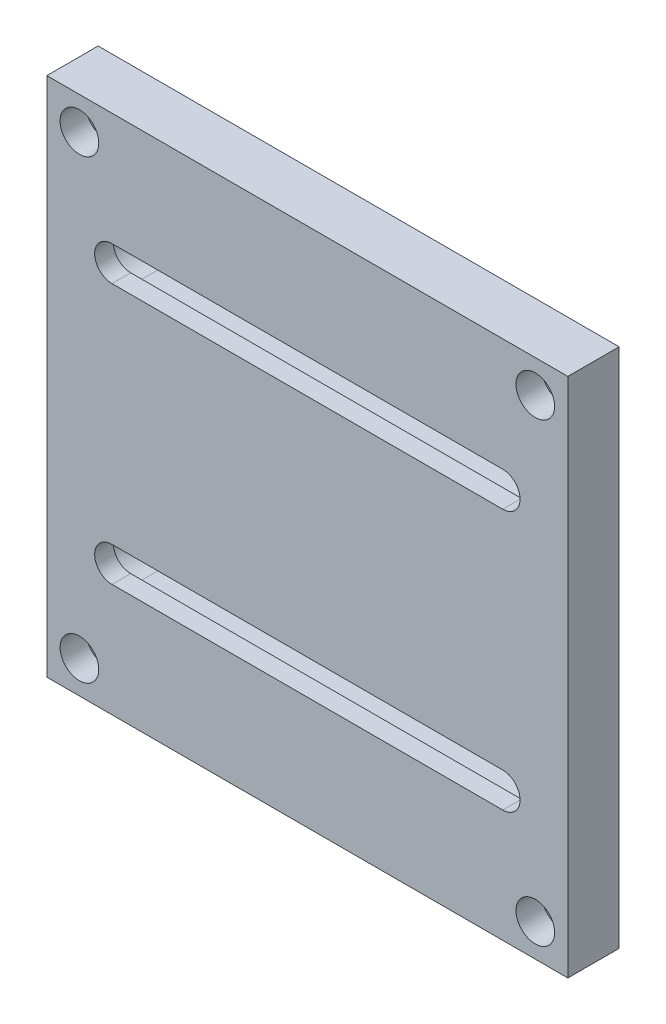
ISO-10303-21;
HEADER;
FILE_DESCRIPTION(('STEP AP214'),'2;1');
FILE_NAME('part.step','',(''),(''),'','','');
FILE_SCHEMA(('AUTOMOTIVE_DESIGN { 1 0 10303 214 1 1 1 1 }'));
ENDSEC;
DATA;
#1=APPLICATION_CONTEXT('core data for automotive mechanical design processes');
#2=APPLICATION_PROTOCOL_DEFINITION('international standard','automotive_design',2000,#1);
#3=PRODUCT_CONTEXT('',#1,'mechanical');
#4=PRODUCT('Part','Part','',(#3));
#5=PRODUCT_RELATED_PRODUCT_CATEGORY('part','',(#4));
#6=PRODUCT_DEFINITION_FORMATION('','',#4);
#7=PRODUCT_DEFINITION_CONTEXT('part definition',#1,'design');
#8=PRODUCT_DEFINITION('design','',#6,#7);
#9=PRODUCT_DEFINITION_SHAPE('','',#8);
#10=(LENGTH_UNIT() NAMED_UNIT(*) SI_UNIT(.MILLI.,.METRE.));
#11=(NAMED_UNIT(*) PLANE_ANGLE_UNIT() SI_UNIT($,.RADIAN.));
#12=(NAMED_UNIT(*) SI_UNIT($,.STERADIAN.) SOLID_ANGLE_UNIT());
#13=UNCERTAINTY_MEASURE_WITH_UNIT(LENGTH_MEASURE(1.E-05),#10,'distance_accuracy_value','');
#14=(GEOMETRIC_REPRESENTATION_CONTEXT(3) GLOBAL_UNCERTAINTY_ASSIGNED_CONTEXT((#13)) GLOBAL_UNIT_ASSIGNED_CONTEXT((#10,
#11,#12)) REPRESENTATION_CONTEXT('',''));
#15=CARTESIAN_POINT('',(0.,0.,0.));
#16=DIRECTION('',(0.,0.,1.));
#17=DIRECTION('',(1.,0.,0.));
#18=AXIS2_PLACEMENT_3D('',#15,#16,#17);
#19=CARTESIAN_POINT('',(-6.35000000000003,-69.85,0.));
#20=DIRECTION('',(0.,0.,-1.));
#21=DIRECTION('',(-1.,0.,0.));
#22=AXIS2_PLACEMENT_3D('',#19,#20,#21);
#23=CYLINDRICAL_SURFACE('',#22,3.3782);
#24=DIRECTION('',(0.,0.,-1.));
#25=VECTOR('',#24,1.);
#26=CARTESIAN_POINT('',(-6.35000000000003,-66.4718,10.));
#27=LINE('',#26,#25);
#28=CARTESIAN_POINT('',(-6.35000000000003,-66.4718,10.));
#29=VERTEX_POINT('',#28);
#30=CARTESIAN_POINT('',(-6.35000000000003,-66.4718,6.35));
#31=VERTEX_POINT('',#30);
#32=EDGE_CURVE('E650',#29,#31,#27,.T.);
#33=ORIENTED_EDGE('',*,*,#32,.T.);
#34=CARTESIAN_POINT('',(-6.35000000000003,-69.85,6.35));
#35=DIRECTION('',(0.,0.,-1.));
#36=DIRECTION('',(-1.,0.,0.));
#37=AXIS2_PLACEMENT_3D('',#34,#35,#36);
#38=CIRCLE('',#37,3.37820000000001);
#39=CARTESIAN_POINT('',(-6.35000000000003,-73.2282,6.35));
#40=VERTEX_POINT('',#39);
#41=EDGE_CURVE('E661',#31,#40,#38,.T.);
#42=ORIENTED_EDGE('',*,*,#41,.T.);
#43=DIRECTION('',(0.,0.,-1.));
#44=VECTOR('',#43,1.);
#45=CARTESIAN_POINT('',(-6.35000000000003,-73.2282,10.));
#46=LINE('',#45,#44);
#47=CARTESIAN_POINT('',(-6.35000000000003,-73.2282,10.));
#48=VERTEX_POINT('',#47);
#49=EDGE_CURVE('E789',#48,#40,#46,.T.);
#50=ORIENTED_EDGE('',*,*,#49,.F.);
#51=CARTESIAN_POINT('',(-6.35000000000003,-69.85,10.));
#52=DIRECTION('',(0.,0.,-1.));
#53=DIRECTION('',(-1.,0.,0.));
#54=AXIS2_PLACEMENT_3D('',#51,#52,#53);
#55=CIRCLE('',#54,3.3782);
#56=EDGE_CURVE('E663',#29,#48,#55,.T.);
#57=ORIENTED_EDGE('',*,*,#56,.F.);
#58=EDGE_LOOP('',(#33,#42,#50,#57));
#59=FACE_BOUND('',#58,.T.);
#60=ADVANCED_FACE('F33',(#59),#23,.F.);
#61=CARTESIAN_POINT('',(-82.55,-19.05,0.));
#62=DIRECTION('',(0.,0.,-1.));
#63=DIRECTION('',(-1.,0.,0.));
#64=AXIS2_PLACEMENT_3D('',#61,#62,#63);
#65=CYLINDRICAL_SURFACE('',#64,3.3782);
#66=DIRECTION('',(0.,0.,-1.));
#67=VECTOR('',#66,1.);
#68=CARTESIAN_POINT('',(-82.55,-22.4282,10.));
#69=LINE('',#68,#67);
#70=CARTESIAN_POINT('',(-82.55,-22.4282,10.));
#71=VERTEX_POINT('',#70);
#72=CARTESIAN_POINT('',(-82.55,-22.4282,6.35));
#73=VERTEX_POINT('',#72);
#74=EDGE_CURVE('E704',#71,#73,#69,.T.);
#75=ORIENTED_EDGE('',*,*,#74,.T.);
#76=CARTESIAN_POINT('',(-82.55,-19.05,6.35));
#77=DIRECTION('',(0.,0.,-1.));
#78=DIRECTION('',(-1.,0.,0.));
#79=AXIS2_PLACEMENT_3D('',#76,#77,#78);
#80=CIRCLE('',#79,3.37820000000001);
#81=CARTESIAN_POINT('',(-82.55,-15.6718,6.35));
#82=VERTEX_POINT('',#81);
#83=EDGE_CURVE('E725',#73,#82,#80,.T.);
#84=ORIENTED_EDGE('',*,*,#83,.T.);
#85=DIRECTION('',(0.,0.,-1.));
#86=VECTOR('',#85,1.);
#87=CARTESIAN_POINT('',(-82.55,-15.6718,10.));
#88=LINE('',#87,#86);
#89=CARTESIAN_POINT('',(-82.55,-15.6718,10.));
#90=VERTEX_POINT('',#89);
#91=EDGE_CURVE('E181',#90,#82,#88,.T.);
#92=ORIENTED_EDGE('',*,*,#91,.F.);
#93=CARTESIAN_POINT('',(-82.55,-19.05,10.));
#94=DIRECTION('',(0.,0.,-1.));
#95=DIRECTION('',(-1.,0.,0.));
#96=AXIS2_PLACEMENT_3D('',#93,#94,#95);
#97=CIRCLE('',#96,3.3782);
#98=EDGE_CURVE('E191',#71,#90,#97,.T.);
#99=ORIENTED_EDGE('',*,*,#98,.F.);
#100=EDGE_LOOP('',(#75,#84,#92,#99));
#101=FACE_BOUND('',#100,.T.);
#102=ADVANCED_FACE('F301',(#101),#65,.F.);
#103=CARTESIAN_POINT('',(6.34999999999999,6.34999999999998,10.));
#104=DIRECTION('',(-1.,0.,0.));
#105=DIRECTION('',(0.,0.,1.));
#106=AXIS2_PLACEMENT_3D('',#103,#104,#105);
#107=PLANE('',#106);
#108=DIRECTION('',(0.,1.,0.));
#109=VECTOR('',#108,1.);
#110=CARTESIAN_POINT('',(6.34999999999999,6.34999999999998,0.));
#111=LINE('',#110,#109);
#112=CARTESIAN_POINT('',(6.34999999999999,-95.25,0.));
#113=VERTEX_POINT('',#112);
#114=CARTESIAN_POINT('',(6.34999999999999,6.34999999999998,0.));
#115=VERTEX_POINT('',#114);
#116=EDGE_CURVE('E251',#113,#115,#111,.T.);
#117=ORIENTED_EDGE('',*,*,#116,.T.);
#118=DIRECTION('',(0.,0.,-1.));
#119=VECTOR('',#118,1.);
#120=CARTESIAN_POINT('',(6.34999999999999,6.34999999999998,10.));
#121=LINE('',#120,#119);
#122=CARTESIAN_POINT('',(6.34999999999999,6.34999999999998,10.));
#123=VERTEX_POINT('',#122);
#124=EDGE_CURVE('E11',#123,#115,#121,.T.);
#125=ORIENTED_EDGE('',*,*,#124,.F.);
#126=DIRECTION('',(0.,1.,0.));
#127=VECTOR('',#126,1.);
#128=CARTESIAN_POINT('',(6.34999999999999,6.34999999999998,10.));
#129=LINE('',#128,#127);
#130=CARTESIAN_POINT('',(6.34999999999999,-95.25,10.));
#131=VERTEX_POINT('',#130);
#132=EDGE_CURVE('E252',#131,#123,#129,.T.);
#133=ORIENTED_EDGE('',*,*,#132,.F.);
#134=DIRECTION('',(0.,0.,-1.));
#135=VECTOR('',#134,1.);
#136=CARTESIAN_POINT('',(6.34999999999999,-95.25,10.));
#137=LINE('',#136,#135);
#138=EDGE_CURVE('E262',#131,#113,#137,.T.);
#139=ORIENTED_EDGE('',*,*,#138,.T.);
#140=EDGE_LOOP('',(#117,#125,#133,#139));
#141=FACE_BOUND('',#140,.T.);
#142=ADVANCED_FACE('F35',(#141),#107,.F.);
#143=CARTESIAN_POINT('',(6.34999999999999,6.34999999999998,10.));
#144=DIRECTION('',(0.,-1.,0.));
#145=DIRECTION('',(0.,0.,-1.));
#146=AXIS2_PLACEMENT_3D('',#143,#144,#145);
#147=PLANE('',#146);
#148=DIRECTION('',(-1.,0.,0.));
#149=VECTOR('',#148,1.);
#150=CARTESIAN_POINT('',(6.34999999999999,6.34999999999998,0.));
#151=LINE('',#150,#149);
#152=CARTESIAN_POINT('',(-95.25,6.34999999999998,0.));
#153=VERTEX_POINT('',#152);
#154=EDGE_CURVE('E265',#115,#153,#151,.T.);
#155=ORIENTED_EDGE('',*,*,#154,.T.);
#156=DIRECTION('',(0.,0.,-1.));
#157=VECTOR('',#156,1.);
#158=CARTESIAN_POINT('',(-95.25,6.34999999999998,10.));
#159=LINE('',#158,#157);
#160=CARTESIAN_POINT('',(-95.25,6.34999999999998,10.));
#161=VERTEX_POINT('',#160);
#162=EDGE_CURVE('E41',#161,#153,#159,.T.);
#163=ORIENTED_EDGE('',*,*,#162,.F.);
#164=DIRECTION('',(-1.,0.,0.));
#165=VECTOR('',#164,1.);
#166=CARTESIAN_POINT('',(6.34999999999999,6.34999999999998,10.));
#167=LINE('',#166,#165);
#168=EDGE_CURVE('E255',#123,#161,#167,.T.);
#169=ORIENTED_EDGE('',*,*,#168,.F.);
#170=ORIENTED_EDGE('',*,*,#124,.T.);
#171=EDGE_LOOP('',(#155,#163,#169,#170));
#172=FACE_BOUND('',#171,.T.);
#173=ADVANCED_FACE('F294',(#172),#147,.F.);
#174=CARTESIAN_POINT('',(-95.25,6.34999999999998,10.));
#175=DIRECTION('',(1.,0.,0.));
#176=DIRECTION('',(0.,0.,-1.));
#177=AXIS2_PLACEMENT_3D('',#174,#175,#176);
#178=PLANE('',#177);
#179=DIRECTION('',(0.,-1.,0.));
#180=VECTOR('',#179,1.);
#181=CARTESIAN_POINT('',(-95.25,6.34999999999998,0.));
#182=LINE('',#181,#180);
#183=CARTESIAN_POINT('',(-95.25,-95.25,0.));
#184=VERTEX_POINT('',#183);
#185=EDGE_CURVE('E267',#153,#184,#182,.T.);
#186=ORIENTED_EDGE('',*,*,#185,.T.);
#187=DIRECTION('',(0.,0.,-1.));
#188=VECTOR('',#187,1.);
#189=CARTESIAN_POINT('',(-95.25,-95.25,10.));
#190=LINE('',#189,#188);
#191=CARTESIAN_POINT('',(-95.25,-95.25,10.));
#192=VERTEX_POINT('',#191);
#193=EDGE_CURVE('E272',#192,#184,#190,.T.);
#194=ORIENTED_EDGE('',*,*,#193,.F.);
#195=DIRECTION('',(0.,-1.,0.));
#196=VECTOR('',#195,1.);
#197=CARTESIAN_POINT('',(-95.25,6.34999999999998,10.));
#198=LINE('',#197,#196);
#199=EDGE_CURVE('E258',#161,#192,#198,.T.);
#200=ORIENTED_EDGE('',*,*,#199,.F.);
#201=ORIENTED_EDGE('',*,*,#162,.T.);
#202=EDGE_LOOP('',(#186,#194,#200,#201));
#203=FACE_BOUND('',#202,.T.);
#204=ADVANCED_FACE('F279',(#203),#178,.F.);
#205=CARTESIAN_POINT('',(6.34999999999999,-95.25,10.));
#206=DIRECTION('',(0.,1.,0.));
#207=DIRECTION('',(0.,0.,1.));
#208=AXIS2_PLACEMENT_3D('',#205,#206,#207);
#209=PLANE('',#208);
#210=DIRECTION('',(1.,0.,0.));
#211=VECTOR('',#210,1.);
#212=CARTESIAN_POINT('',(6.34999999999999,-95.25,0.));
#213=LINE('',#212,#211);
#214=EDGE_CURVE('E256',#184,#113,#213,.T.);
#215=ORIENTED_EDGE('',*,*,#214,.T.);
#216=ORIENTED_EDGE('',*,*,#138,.F.);
#217=DIRECTION('',(1.,0.,0.));
#218=VECTOR('',#217,1.);
#219=CARTESIAN_POINT('',(6.34999999999999,-95.25,10.));
#220=LINE('',#219,#218);
#221=EDGE_CURVE('E260',#192,#131,#220,.T.);
#222=ORIENTED_EDGE('',*,*,#221,.F.);
#223=ORIENTED_EDGE('',*,*,#193,.T.);
#224=EDGE_LOOP('',(#215,#216,#222,#223));
#225=FACE_BOUND('',#224,.T.);
#226=ADVANCED_FACE('F288',(#225),#209,.F.);
#227=CARTESIAN_POINT('',(0.,0.,10.));
#228=DIRECTION('',(0.,0.,-1.));
#229=DIRECTION('',(-1.,0.,0.));
#230=AXIS2_PLACEMENT_3D('',#227,#228,#229);
#231=PLANE('',#230);
#232=CARTESIAN_POINT('',(-6.35000000000003,-19.05,10.));
#233=DIRECTION('',(0.,0.,-1.));
#234=DIRECTION('',(-1.,0.,0.));
#235=AXIS2_PLACEMENT_3D('',#232,#233,#234);
#236=CIRCLE('',#235,3.3782);
#237=CARTESIAN_POINT('',(-6.35000000000003,-15.6718,10.));
#238=VERTEX_POINT('',#237);
#239=CARTESIAN_POINT('',(-6.35000000000003,-22.4282,10.));
#240=VERTEX_POINT('',#239);
#241=EDGE_CURVE('E189',#238,#240,#236,.T.);
#242=ORIENTED_EDGE('',*,*,#241,.T.);
#243=DIRECTION('',(-1.,0.,0.));
#244=VECTOR('',#243,1.);
#245=CARTESIAN_POINT('',(-82.55,-22.4282,10.));
#246=LINE('',#245,#244);
#247=EDGE_CURVE('E192',#240,#71,#246,.T.);
#248=ORIENTED_EDGE('',*,*,#247,.T.);
#249=ORIENTED_EDGE('',*,*,#98,.T.);
#250=DIRECTION('',(1.,0.,0.));
#251=VECTOR('',#250,1.);
#252=CARTESIAN_POINT('',(-82.55,-15.6718,10.));
#253=LINE('',#252,#251);
#254=EDGE_CURVE('E172',#90,#238,#253,.T.);
#255=ORIENTED_EDGE('',*,*,#254,.T.);
#256=EDGE_LOOP('',(#242,#248,#249,#255));
#257=FACE_BOUND('',#256,.T.);
#258=CARTESIAN_POINT('',(-82.55,-69.85,10.));
#259=DIRECTION('',(0.,0.,-1.));
#260=DIRECTION('',(-1.,0.,0.));
#261=AXIS2_PLACEMENT_3D('',#258,#259,#260);
#262=CIRCLE('',#261,3.3782);
#263=CARTESIAN_POINT('',(-82.55,-73.2282,10.));
#264=VERTEX_POINT('',#263);
#265=CARTESIAN_POINT('',(-82.55,-66.4718,10.));
#266=VERTEX_POINT('',#265);
#267=EDGE_CURVE('E737',#264,#266,#262,.T.);
#268=ORIENTED_EDGE('',*,*,#267,.T.);
#269=DIRECTION('',(1.,0.,0.));
#270=VECTOR('',#269,1.);
#271=CARTESIAN_POINT('',(-6.35000000000003,-66.4718,10.));
#272=LINE('',#271,#270);
#273=EDGE_CURVE('E56',#266,#29,#272,.T.);
#274=ORIENTED_EDGE('',*,*,#273,.T.);
#275=ORIENTED_EDGE('',*,*,#56,.T.);
#276=DIRECTION('',(-1.,0.,0.));
#277=VECTOR('',#276,1.);
#278=CARTESIAN_POINT('',(-6.35000000000003,-73.2282,10.));
#279=LINE('',#278,#277);
#280=EDGE_CURVE('E656',#48,#264,#279,.T.);
#281=ORIENTED_EDGE('',*,*,#280,.T.);
#282=EDGE_LOOP('',(#268,#274,#275,#281));
#283=FACE_BOUND('',#282,.T.);
#284=CARTESIAN_POINT('',(0.,0.,10.));
#285=DIRECTION('',(0.,0.,1.));
#286=DIRECTION('',(1.,0.,0.));
#287=AXIS2_PLACEMENT_3D('',#284,#285,#286);
#288=CIRCLE('',#287,3.77063);
#289=CARTESIAN_POINT('',(3.77063,0.,10.));
#290=VERTEX_POINT('',#289);
#291=EDGE_CURVE('E197',#290,#290,#288,.T.);
#292=ORIENTED_EDGE('',*,*,#291,.F.);
#293=EDGE_LOOP('',(#292));
#294=FACE_BOUND('',#293,.T.);
#295=CARTESIAN_POINT('',(0.,-88.9,10.));
#296=DIRECTION('',(0.,0.,1.));
#297=DIRECTION('',(1.,0.,0.));
#298=AXIS2_PLACEMENT_3D('',#295,#296,#297);
#299=CIRCLE('',#298,3.77063);
#300=CARTESIAN_POINT('',(3.77063,-88.9,10.));
#301=VERTEX_POINT('',#300);
#302=EDGE_CURVE('E215',#301,#301,#299,.T.);
#303=ORIENTED_EDGE('',*,*,#302,.F.);
#304=EDGE_LOOP('',(#303));
#305=FACE_BOUND('',#304,.T.);
#306=CARTESIAN_POINT('',(-88.9,-88.9,10.));
#307=DIRECTION('',(0.,0.,1.));
#308=DIRECTION('',(1.,0.,0.));
#309=AXIS2_PLACEMENT_3D('',#306,#307,#308);
#310=CIRCLE('',#309,3.77063);
#311=CARTESIAN_POINT('',(-85.12937,-88.9,10.));
#312=VERTEX_POINT('',#311);
#313=EDGE_CURVE('E227',#312,#312,#310,.T.);
#314=ORIENTED_EDGE('',*,*,#313,.F.);
#315=EDGE_LOOP('',(#314));
#316=FACE_BOUND('',#315,.T.);
#317=CARTESIAN_POINT('',(-88.9,0.,10.));
#318=DIRECTION('',(0.,0.,1.));
#319=DIRECTION('',(1.,0.,0.));
#320=AXIS2_PLACEMENT_3D('',#317,#318,#319);
#321=CIRCLE('',#320,3.77063);
#322=CARTESIAN_POINT('',(-85.12937,0.,10.));
#323=VERTEX_POINT('',#322);
#324=EDGE_CURVE('E239',#323,#323,#321,.T.);
#325=ORIENTED_EDGE('',*,*,#324,.F.);
#326=EDGE_LOOP('',(#325));
#327=FACE_BOUND('',#326,.T.);
#328=ORIENTED_EDGE('',*,*,#132,.T.);
#329=ORIENTED_EDGE('',*,*,#168,.T.);
#330=ORIENTED_EDGE('',*,*,#199,.T.);
#331=ORIENTED_EDGE('',*,*,#221,.T.);
#332=EDGE_LOOP('',(#328,#329,#330,#331));
#333=FACE_BOUND('',#332,.T.);
#334=ADVANCED_FACE('F186',(#257,#283,#294,#305,#316,#327,#333),#231,.F.);
#335=CARTESIAN_POINT('',(0.,0.,0.));
#336=DIRECTION('',(0.,0.,-1.));
#337=DIRECTION('',(-1.,0.,0.));
#338=AXIS2_PLACEMENT_3D('',#335,#336,#337);
#339=PLANE('',#338);
#340=DIRECTION('',(1.,0.,0.));
#341=VECTOR('',#340,1.);
#342=CARTESIAN_POINT('',(-82.55,-13.49375,0.));
#343=LINE('',#342,#341);
#344=CARTESIAN_POINT('',(-82.55,-13.49375,0.));
#345=VERTEX_POINT('',#344);
#346=CARTESIAN_POINT('',(-6.35000000000003,-13.49375,0.));
#347=VERTEX_POINT('',#346);
#348=EDGE_CURVE('E720',#345,#347,#343,.T.);
#349=ORIENTED_EDGE('',*,*,#348,.F.);
#350=CARTESIAN_POINT('',(-82.55,-19.05,0.));
#351=DIRECTION('',(0.,0.,-1.));
#352=DIRECTION('',(-1.,0.,0.));
#353=AXIS2_PLACEMENT_3D('',#350,#351,#352);
#354=CIRCLE('',#353,5.55625);
#355=CARTESIAN_POINT('',(-82.55,-24.60625,0.));
#356=VERTEX_POINT('',#355);
#357=EDGE_CURVE('E698',#356,#345,#354,.T.);
#358=ORIENTED_EDGE('',*,*,#357,.F.);
#359=DIRECTION('',(-1.,0.,0.));
#360=VECTOR('',#359,1.);
#361=CARTESIAN_POINT('',(-82.55,-24.60625,0.));
#362=LINE('',#361,#360);
#363=CARTESIAN_POINT('',(-6.35000000000003,-24.60625,0.));
#364=VERTEX_POINT('',#363);
#365=EDGE_CURVE('E793',#364,#356,#362,.T.);
#366=ORIENTED_EDGE('',*,*,#365,.F.);
#367=CARTESIAN_POINT('',(-6.35000000000003,-19.05,0.));
#368=DIRECTION('',(0.,0.,-1.));
#369=DIRECTION('',(-1.,0.,0.));
#370=AXIS2_PLACEMENT_3D('',#367,#368,#369);
#371=CIRCLE('',#370,5.55625);
#372=EDGE_CURVE('E667',#347,#364,#371,.T.);
#373=ORIENTED_EDGE('',*,*,#372,.F.);
#374=EDGE_LOOP('',(#349,#358,#366,#373));
#375=FACE_BOUND('',#374,.T.);
#376=DIRECTION('',(-1.,0.,0.));
#377=VECTOR('',#376,1.);
#378=CARTESIAN_POINT('',(-6.35000000000003,-75.40625,0.));
#379=LINE('',#378,#377);
#380=CARTESIAN_POINT('',(-6.35000000000003,-75.40625,0.));
#381=VERTEX_POINT('',#380);
#382=CARTESIAN_POINT('',(-82.55,-75.40625,0.));
#383=VERTEX_POINT('',#382);
#384=EDGE_CURVE('E702',#381,#383,#379,.T.);
#385=ORIENTED_EDGE('',*,*,#384,.F.);
#386=CARTESIAN_POINT('',(-6.35000000000003,-69.85,0.));
#387=DIRECTION('',(0.,0.,-1.));
#388=DIRECTION('',(-1.,0.,0.));
#389=AXIS2_PLACEMENT_3D('',#386,#387,#388);
#390=CIRCLE('',#389,5.55625);
#391=CARTESIAN_POINT('',(-6.35000000000003,-64.29375,0.));
#392=VERTEX_POINT('',#391);
#393=EDGE_CURVE('E670',#392,#381,#390,.T.);
#394=ORIENTED_EDGE('',*,*,#393,.F.);
#395=DIRECTION('',(1.,0.,0.));
#396=VECTOR('',#395,1.);
#397=CARTESIAN_POINT('',(-6.35000000000003,-64.29375,0.));
#398=LINE('',#397,#396);
#399=CARTESIAN_POINT('',(-82.55,-64.29375,0.));
#400=VERTEX_POINT('',#399);
#401=EDGE_CURVE('E699',#400,#392,#398,.T.);
#402=ORIENTED_EDGE('',*,*,#401,.F.);
#403=CARTESIAN_POINT('',(-82.55,-69.85,0.));
#404=DIRECTION('',(0.,0.,-1.));
#405=DIRECTION('',(-1.,0.,0.));
#406=AXIS2_PLACEMENT_3D('',#403,#404,#405);
#407=CIRCLE('',#406,5.55625);
#408=EDGE_CURVE('E729',#383,#400,#407,.T.);
#409=ORIENTED_EDGE('',*,*,#408,.F.);
#410=EDGE_LOOP('',(#385,#394,#402,#409));
#411=FACE_BOUND('',#410,.T.);
#412=CARTESIAN_POINT('',(0.,0.,0.));
#413=DIRECTION('',(0.,0.,1.));
#414=DIRECTION('',(1.,0.,0.));
#415=AXIS2_PLACEMENT_3D('',#412,#413,#414);
#416=CIRCLE('',#415,1.89865);
#417=CARTESIAN_POINT('',(1.89865,0.,0.));
#418=VERTEX_POINT('',#417);
#419=EDGE_CURVE('E212',#418,#418,#416,.T.);
#420=ORIENTED_EDGE('',*,*,#419,.T.);
#421=EDGE_LOOP('',(#420));
#422=FACE_BOUND('',#421,.T.);
#423=CARTESIAN_POINT('',(0.,-88.9,0.));
#424=DIRECTION('',(0.,0.,1.));
#425=DIRECTION('',(1.,0.,0.));
#426=AXIS2_PLACEMENT_3D('',#423,#424,#425);
#427=CIRCLE('',#426,1.89865);
#428=CARTESIAN_POINT('',(1.89865,-88.9,0.));
#429=VERTEX_POINT('',#428);
#430=EDGE_CURVE('E224',#429,#429,#427,.T.);
#431=ORIENTED_EDGE('',*,*,#430,.T.);
#432=EDGE_LOOP('',(#431));
#433=FACE_BOUND('',#432,.T.);
#434=CARTESIAN_POINT('',(-88.9,-88.9,0.));
#435=DIRECTION('',(0.,0.,1.));
#436=DIRECTION('',(1.,0.,0.));
#437=AXIS2_PLACEMENT_3D('',#434,#435,#436);
#438=CIRCLE('',#437,1.89865);
#439=CARTESIAN_POINT('',(-87.00135,-88.9,0.));
#440=VERTEX_POINT('',#439);
#441=EDGE_CURVE('E236',#440,#440,#438,.T.);
#442=ORIENTED_EDGE('',*,*,#441,.T.);
#443=EDGE_LOOP('',(#442));
#444=FACE_BOUND('',#443,.T.);
#445=CARTESIAN_POINT('',(-88.9,0.,0.));
#446=DIRECTION('',(0.,0.,1.));
#447=DIRECTION('',(1.,0.,0.));
#448=AXIS2_PLACEMENT_3D('',#445,#446,#447);
#449=CIRCLE('',#448,1.89865);
#450=CARTESIAN_POINT('',(-87.00135,0.,0.));
#451=VERTEX_POINT('',#450);
#452=EDGE_CURVE('E248',#451,#451,#449,.T.);
#453=ORIENTED_EDGE('',*,*,#452,.T.);
#454=EDGE_LOOP('',(#453));
#455=FACE_BOUND('',#454,.T.);
#456=ORIENTED_EDGE('',*,*,#116,.F.);
#457=ORIENTED_EDGE('',*,*,#214,.F.);
#458=ORIENTED_EDGE('',*,*,#185,.F.);
#459=ORIENTED_EDGE('',*,*,#154,.F.);
#460=EDGE_LOOP('',(#456,#457,#458,#459));
#461=FACE_BOUND('',#460,.T.);
#462=ADVANCED_FACE('F285',(#375,#411,#422,#433,#444,#455,#461),#339,.T.);
#463=CARTESIAN_POINT('',(-88.9,0.,10.));
#464=DIRECTION('',(0.,0.,1.));
#465=DIRECTION('',(1.,0.,0.));
#466=AXIS2_PLACEMENT_3D('',#463,#464,#465);
#467=CYLINDRICAL_SURFACE('',#466,1.89865);
#468=ORIENTED_EDGE('',*,*,#452,.F.);
#469=EDGE_LOOP('',(#468));
#470=FACE_BOUND('',#469,.T.);
#471=CARTESIAN_POINT('',(-88.9,0.,4.92));
#472=DIRECTION('',(0.,0.,1.));
#473=DIRECTION('',(1.,0.,0.));
#474=AXIS2_PLACEMENT_3D('',#471,#472,#473);
#475=CIRCLE('',#474,1.89865);
#476=CARTESIAN_POINT('',(-87.00135,0.,4.92));
#477=VERTEX_POINT('',#476);
#478=EDGE_CURVE('E245',#477,#477,#475,.T.);
#479=ORIENTED_EDGE('',*,*,#478,.T.);
#480=EDGE_LOOP('',(#479));
#481=FACE_BOUND('',#480,.T.);
#482=ADVANCED_FACE('F368',(#470,#481),#467,.F.);
#483=CARTESIAN_POINT('',(-87.00135,0.,4.92));
#484=DIRECTION('',(0.,0.,-1.));
#485=DIRECTION('',(-1.,0.,0.));
#486=AXIS2_PLACEMENT_3D('',#483,#484,#485);
#487=PLANE('',#486);
#488=ORIENTED_EDGE('',*,*,#478,.F.);
#489=EDGE_LOOP('',(#488));
#490=FACE_BOUND('',#489,.T.);
#491=CARTESIAN_POINT('',(-88.9,0.,4.92));
#492=DIRECTION('',(0.,0.,1.));
#493=DIRECTION('',(1.,0.,0.));
#494=AXIS2_PLACEMENT_3D('',#491,#492,#493);
#495=CIRCLE('',#494,3.77063);
#496=CARTESIAN_POINT('',(-85.12937,0.,4.92));
#497=VERTEX_POINT('',#496);
#498=EDGE_CURVE('E242',#497,#497,#495,.T.);
#499=ORIENTED_EDGE('',*,*,#498,.T.);
#500=EDGE_LOOP('',(#499));
#501=FACE_BOUND('',#500,.T.);
#502=ADVANCED_FACE('F364',(#490,#501),#487,.F.);
#503=CARTESIAN_POINT('',(-88.9,0.,10.));
#504=DIRECTION('',(0.,0.,1.));
#505=DIRECTION('',(1.,0.,0.));
#506=AXIS2_PLACEMENT_3D('',#503,#504,#505);
#507=CYLINDRICAL_SURFACE('',#506,3.77063);
#508=ORIENTED_EDGE('',*,*,#498,.F.);
#509=EDGE_LOOP('',(#508));
#510=FACE_BOUND('',#509,.T.);
#511=ORIENTED_EDGE('',*,*,#324,.T.);
#512=EDGE_LOOP('',(#511));
#513=FACE_BOUND('',#512,.T.);
#514=ADVANCED_FACE('F360',(#510,#513),#507,.F.);
#515=CARTESIAN_POINT('',(-88.9,-88.9,10.));
#516=DIRECTION('',(0.,0.,1.));
#517=DIRECTION('',(1.,0.,0.));
#518=AXIS2_PLACEMENT_3D('',#515,#516,#517);
#519=CYLINDRICAL_SURFACE('',#518,1.89865);
#520=ORIENTED_EDGE('',*,*,#441,.F.);
#521=EDGE_LOOP('',(#520));
#522=FACE_BOUND('',#521,.T.);
#523=CARTESIAN_POINT('',(-88.9,-88.9,4.92));
#524=DIRECTION('',(0.,0.,1.));
#525=DIRECTION('',(1.,0.,0.));
#526=AXIS2_PLACEMENT_3D('',#523,#524,#525);
#527=CIRCLE('',#526,1.89865);
#528=CARTESIAN_POINT('',(-87.00135,-88.9,4.92));
#529=VERTEX_POINT('',#528);
#530=EDGE_CURVE('E233',#529,#529,#527,.T.);
#531=ORIENTED_EDGE('',*,*,#530,.T.);
#532=EDGE_LOOP('',(#531));
#533=FACE_BOUND('',#532,.T.);
#534=ADVANCED_FACE('F356',(#522,#533),#519,.F.);
#535=CARTESIAN_POINT('',(-87.00135,-88.9,4.92));
#536=DIRECTION('',(0.,0.,-1.));
#537=DIRECTION('',(-1.,0.,0.));
#538=AXIS2_PLACEMENT_3D('',#535,#536,#537);
#539=PLANE('',#538);
#540=ORIENTED_EDGE('',*,*,#530,.F.);
#541=EDGE_LOOP('',(#540));
#542=FACE_BOUND('',#541,.T.);
#543=CARTESIAN_POINT('',(-88.9,-88.9,4.92));
#544=DIRECTION('',(0.,0.,1.));
#545=DIRECTION('',(1.,0.,0.));
#546=AXIS2_PLACEMENT_3D('',#543,#544,#545);
#547=CIRCLE('',#546,3.77063);
#548=CARTESIAN_POINT('',(-85.12937,-88.9,4.92));
#549=VERTEX_POINT('',#548);
#550=EDGE_CURVE('E230',#549,#549,#547,.T.);
#551=ORIENTED_EDGE('',*,*,#550,.T.);
#552=EDGE_LOOP('',(#551));
#553=FACE_BOUND('',#552,.T.);
#554=ADVANCED_FACE('F352',(#542,#553),#539,.F.);
#555=CARTESIAN_POINT('',(-88.9,-88.9,10.));
#556=DIRECTION('',(0.,0.,1.));
#557=DIRECTION('',(1.,0.,0.));
#558=AXIS2_PLACEMENT_3D('',#555,#556,#557);
#559=CYLINDRICAL_SURFACE('',#558,3.77063);
#560=ORIENTED_EDGE('',*,*,#550,.F.);
#561=EDGE_LOOP('',(#560));
#562=FACE_BOUND('',#561,.T.);
#563=ORIENTED_EDGE('',*,*,#313,.T.);
#564=EDGE_LOOP('',(#563));
#565=FACE_BOUND('',#564,.T.);
#566=ADVANCED_FACE('F348',(#562,#565),#559,.F.);
#567=CARTESIAN_POINT('',(0.,-88.9,10.));
#568=DIRECTION('',(0.,0.,1.));
#569=DIRECTION('',(1.,0.,0.));
#570=AXIS2_PLACEMENT_3D('',#567,#568,#569);
#571=CYLINDRICAL_SURFACE('',#570,1.89865);
#572=ORIENTED_EDGE('',*,*,#430,.F.);
#573=EDGE_LOOP('',(#572));
#574=FACE_BOUND('',#573,.T.);
#575=CARTESIAN_POINT('',(0.,-88.9,4.92));
#576=DIRECTION('',(0.,0.,1.));
#577=DIRECTION('',(1.,0.,0.));
#578=AXIS2_PLACEMENT_3D('',#575,#576,#577);
#579=CIRCLE('',#578,1.89865);
#580=CARTESIAN_POINT('',(1.89865,-88.9,4.92));
#581=VERTEX_POINT('',#580);
#582=EDGE_CURVE('E221',#581,#581,#579,.T.);
#583=ORIENTED_EDGE('',*,*,#582,.T.);
#584=EDGE_LOOP('',(#583));
#585=FACE_BOUND('',#584,.T.);
#586=ADVANCED_FACE('F344',(#574,#585),#571,.F.);
#587=CARTESIAN_POINT('',(1.89865,-88.9,4.92));
#588=DIRECTION('',(0.,0.,-1.));
#589=DIRECTION('',(-1.,0.,0.));
#590=AXIS2_PLACEMENT_3D('',#587,#588,#589);
#591=PLANE('',#590);
#592=ORIENTED_EDGE('',*,*,#582,.F.);
#593=EDGE_LOOP('',(#592));
#594=FACE_BOUND('',#593,.T.);
#595=CARTESIAN_POINT('',(0.,-88.9,4.92));
#596=DIRECTION('',(0.,0.,1.));
#597=DIRECTION('',(1.,0.,0.));
#598=AXIS2_PLACEMENT_3D('',#595,#596,#597);
#599=CIRCLE('',#598,3.77063);
#600=CARTESIAN_POINT('',(3.77063,-88.9,4.92));
#601=VERTEX_POINT('',#600);
#602=EDGE_CURVE('E218',#601,#601,#599,.T.);
#603=ORIENTED_EDGE('',*,*,#602,.T.);
#604=EDGE_LOOP('',(#603));
#605=FACE_BOUND('',#604,.T.);
#606=ADVANCED_FACE('F340',(#594,#605),#591,.F.);
#607=CARTESIAN_POINT('',(0.,-88.9,10.));
#608=DIRECTION('',(0.,0.,1.));
#609=DIRECTION('',(1.,0.,0.));
#610=AXIS2_PLACEMENT_3D('',#607,#608,#609);
#611=CYLINDRICAL_SURFACE('',#610,3.77063);
#612=ORIENTED_EDGE('',*,*,#602,.F.);
#613=EDGE_LOOP('',(#612));
#614=FACE_BOUND('',#613,.T.);
#615=ORIENTED_EDGE('',*,*,#302,.T.);
#616=EDGE_LOOP('',(#615));
#617=FACE_BOUND('',#616,.T.);
#618=ADVANCED_FACE('F336',(#614,#617),#611,.F.);
#619=CARTESIAN_POINT('',(0.,0.,10.));
#620=DIRECTION('',(0.,0.,1.));
#621=DIRECTION('',(1.,0.,0.));
#622=AXIS2_PLACEMENT_3D('',#619,#620,#621);
#623=CYLINDRICAL_SURFACE('',#622,1.89865);
#624=ORIENTED_EDGE('',*,*,#419,.F.);
#625=EDGE_LOOP('',(#624));
#626=FACE_BOUND('',#625,.T.);
#627=CARTESIAN_POINT('',(0.,0.,4.92));
#628=DIRECTION('',(0.,0.,1.));
#629=DIRECTION('',(1.,0.,0.));
#630=AXIS2_PLACEMENT_3D('',#627,#628,#629);
#631=CIRCLE('',#630,1.89865);
#632=CARTESIAN_POINT('',(1.89865,0.,4.92));
#633=VERTEX_POINT('',#632);
#634=EDGE_CURVE('E209',#633,#633,#631,.T.);
#635=ORIENTED_EDGE('',*,*,#634,.T.);
#636=EDGE_LOOP('',(#635));
#637=FACE_BOUND('',#636,.T.);
#638=ADVANCED_FACE('F332',(#626,#637),#623,.F.);
#639=CARTESIAN_POINT('',(1.89865,0.,4.92));
#640=DIRECTION('',(0.,0.,-1.));
#641=DIRECTION('',(-1.,0.,0.));
#642=AXIS2_PLACEMENT_3D('',#639,#640,#641);
#643=PLANE('',#642);
#644=ORIENTED_EDGE('',*,*,#634,.F.);
#645=EDGE_LOOP('',(#644));
#646=FACE_BOUND('',#645,.T.);
#647=CARTESIAN_POINT('',(0.,0.,4.92));
#648=DIRECTION('',(0.,0.,1.));
#649=DIRECTION('',(1.,0.,0.));
#650=AXIS2_PLACEMENT_3D('',#647,#648,#649);
#651=CIRCLE('',#650,3.77063);
#652=CARTESIAN_POINT('',(3.77063,0.,4.92));
#653=VERTEX_POINT('',#652);
#654=EDGE_CURVE('E201',#653,#653,#651,.T.);
#655=ORIENTED_EDGE('',*,*,#654,.T.);
#656=EDGE_LOOP('',(#655));
#657=FACE_BOUND('',#656,.T.);
#658=ADVANCED_FACE('F328',(#646,#657),#643,.F.);
#659=CARTESIAN_POINT('',(0.,0.,10.));
#660=DIRECTION('',(0.,0.,1.));
#661=DIRECTION('',(1.,0.,0.));
#662=AXIS2_PLACEMENT_3D('',#659,#660,#661);
#663=CYLINDRICAL_SURFACE('',#662,3.77063);
#664=ORIENTED_EDGE('',*,*,#654,.F.);
#665=EDGE_LOOP('',(#664));
#666=FACE_BOUND('',#665,.T.);
#667=ORIENTED_EDGE('',*,*,#291,.T.);
#668=EDGE_LOOP('',(#667));
#669=FACE_BOUND('',#668,.T.);
#670=ADVANCED_FACE('F325',(#666,#669),#663,.F.);
#671=CARTESIAN_POINT('',(-6.35000000000003,-19.05,0.));
#672=DIRECTION('',(0.,0.,-1.));
#673=DIRECTION('',(-1.,0.,0.));
#674=AXIS2_PLACEMENT_3D('',#671,#672,#673);
#675=CYLINDRICAL_SURFACE('',#674,3.3782);
#676=CARTESIAN_POINT('',(-6.35000000000003,-19.05,6.35));
#677=DIRECTION('',(0.,0.,-1.));
#678=DIRECTION('',(-1.,0.,0.));
#679=AXIS2_PLACEMENT_3D('',#676,#677,#678);
#680=CIRCLE('',#679,3.37820000000001);
#681=CARTESIAN_POINT('',(-6.35000000000003,-15.6718,6.35));
#682=VERTEX_POINT('',#681);
#683=CARTESIAN_POINT('',(-6.35000000000003,-22.4282,6.35));
#684=VERTEX_POINT('',#683);
#685=EDGE_CURVE('E198',#682,#684,#680,.T.);
#686=ORIENTED_EDGE('',*,*,#685,.T.);
#687=DIRECTION('',(0.,0.,-1.));
#688=VECTOR('',#687,1.);
#689=CARTESIAN_POINT('',(-6.35000000000003,-22.4282,10.));
#690=LINE('',#689,#688);
#691=EDGE_CURVE('E180',#240,#684,#690,.T.);
#692=ORIENTED_EDGE('',*,*,#691,.F.);
#693=ORIENTED_EDGE('',*,*,#241,.F.);
#694=DIRECTION('',(0.,0.,-1.));
#695=VECTOR('',#694,1.);
#696=CARTESIAN_POINT('',(-6.35000000000003,-15.6718,10.));
#697=LINE('',#696,#695);
#698=EDGE_CURVE('E169',#238,#682,#697,.T.);
#699=ORIENTED_EDGE('',*,*,#698,.T.);
#700=EDGE_LOOP('',(#686,#692,#693,#699));
#701=FACE_BOUND('',#700,.T.);
#702=ADVANCED_FACE('F196',(#701),#675,.F.);
#703=CARTESIAN_POINT('',(-2.97180000000002,-19.05,6.35));
#704=DIRECTION('',(0.,0.,1.));
#705=DIRECTION('',(1.,0.,0.));
#706=AXIS2_PLACEMENT_3D('',#703,#704,#705);
#707=PLANE('',#706);
#708=ORIENTED_EDGE('',*,*,#83,.F.);
#709=DIRECTION('',(-1.,0.,0.));
#710=VECTOR('',#709,1.);
#711=CARTESIAN_POINT('',(-82.55,-22.4282,6.35));
#712=LINE('',#711,#710);
#713=EDGE_CURVE('E193',#684,#73,#712,.T.);
#714=ORIENTED_EDGE('',*,*,#713,.F.);
#715=ORIENTED_EDGE('',*,*,#685,.F.);
#716=DIRECTION('',(1.,0.,0.));
#717=VECTOR('',#716,1.);
#718=CARTESIAN_POINT('',(-82.55,-15.6718,6.35));
#719=LINE('',#718,#717);
#720=EDGE_CURVE('E175',#82,#682,#719,.T.);
#721=ORIENTED_EDGE('',*,*,#720,.F.);
#722=EDGE_LOOP('',(#708,#714,#715,#721));
#723=FACE_BOUND('',#722,.T.);
#724=CARTESIAN_POINT('',(-6.35000000000003,-19.05,6.35));
#725=DIRECTION('',(0.,0.,-1.));
#726=DIRECTION('',(-1.,0.,0.));
#727=AXIS2_PLACEMENT_3D('',#724,#725,#726);
#728=CIRCLE('',#727,5.55625);
#729=CARTESIAN_POINT('',(-6.35000000000003,-13.49375,6.34999999999999));
#730=VERTEX_POINT('',#729);
#731=CARTESIAN_POINT('',(-6.35000000000003,-24.60625,6.34999999999999));
#732=VERTEX_POINT('',#731);
#733=EDGE_CURVE('E203',#730,#732,#728,.T.);
#734=ORIENTED_EDGE('',*,*,#733,.T.);
#735=DIRECTION('',(-1.,0.,0.));
#736=VECTOR('',#735,1.);
#737=CARTESIAN_POINT('',(-82.55,-24.60625,6.34999999999999));
#738=LINE('',#737,#736);
#739=CARTESIAN_POINT('',(-82.55,-24.60625,6.34999999999999));
#740=VERTEX_POINT('',#739);
#741=EDGE_CURVE('E681',#732,#740,#738,.T.);
#742=ORIENTED_EDGE('',*,*,#741,.T.);
#743=CARTESIAN_POINT('',(-82.55,-19.05,6.35));
#744=DIRECTION('',(0.,0.,-1.));
#745=DIRECTION('',(-1.,0.,0.));
#746=AXIS2_PLACEMENT_3D('',#743,#744,#745);
#747=CIRCLE('',#746,5.55625);
#748=CARTESIAN_POINT('',(-82.55,-13.49375,6.34999999999999));
#749=VERTEX_POINT('',#748);
#750=EDGE_CURVE('E723',#740,#749,#747,.T.);
#751=ORIENTED_EDGE('',*,*,#750,.T.);
#752=DIRECTION('',(1.,0.,0.));
#753=VECTOR('',#752,1.);
#754=CARTESIAN_POINT('',(-82.55,-13.49375,6.34999999999999));
#755=LINE('',#754,#753);
#756=EDGE_CURVE('E683',#749,#730,#755,.T.);
#757=ORIENTED_EDGE('',*,*,#756,.T.);
#758=EDGE_LOOP('',(#734,#742,#751,#757));
#759=FACE_BOUND('',#758,.T.);
#760=ADVANCED_FACE('F318',(#723,#759),#707,.F.);
#761=CARTESIAN_POINT('',(-6.35000000000003,-19.05,0.));
#762=DIRECTION('',(0.,0.,-1.));
#763=DIRECTION('',(-1.,0.,0.));
#764=AXIS2_PLACEMENT_3D('',#761,#762,#763);
#765=CYLINDRICAL_SURFACE('',#764,5.55625);
#766=ORIENTED_EDGE('',*,*,#733,.F.);
#767=DIRECTION('',(0.,0.,-1.));
#768=VECTOR('',#767,1.);
#769=CARTESIAN_POINT('',(-6.35000000000003,-13.49375,83.3560235062816));
#770=LINE('',#769,#768);
#771=EDGE_CURVE('E686',#730,#347,#770,.T.);
#772=ORIENTED_EDGE('',*,*,#771,.T.);
#773=ORIENTED_EDGE('',*,*,#372,.T.);
#774=DIRECTION('',(0.,0.,-1.));
#775=VECTOR('',#774,1.);
#776=CARTESIAN_POINT('',(-6.35000000000003,-24.60625,83.3560235062816));
#777=LINE('',#776,#775);
#778=EDGE_CURVE('E688',#732,#364,#777,.T.);
#779=ORIENTED_EDGE('',*,*,#778,.F.);
#780=EDGE_LOOP('',(#766,#772,#773,#779));
#781=FACE_BOUND('',#780,.T.);
#782=ADVANCED_FACE('F315',(#781),#765,.F.);
#783=CARTESIAN_POINT('',(-2.97180000000002,-69.85,6.35));
#784=DIRECTION('',(0.,0.,1.));
#785=DIRECTION('',(1.,0.,0.));
#786=AXIS2_PLACEMENT_3D('',#783,#784,#785);
#787=PLANE('',#786);
#788=CARTESIAN_POINT('',(-6.35000000000003,-69.85,6.35));
#789=DIRECTION('',(0.,0.,-1.));
#790=DIRECTION('',(-1.,0.,0.));
#791=AXIS2_PLACEMENT_3D('',#788,#789,#790);
#792=CIRCLE('',#791,5.55625);
#793=CARTESIAN_POINT('',(-6.35000000000003,-64.29375,6.34999999999999));
#794=VERTEX_POINT('',#793);
#795=CARTESIAN_POINT('',(-6.35000000000003,-75.40625,6.34999999999999));
#796=VERTEX_POINT('',#795);
#797=EDGE_CURVE('E665',#794,#796,#792,.T.);
#798=ORIENTED_EDGE('',*,*,#797,.T.);
#799=DIRECTION('',(-1.,0.,0.));
#800=VECTOR('',#799,1.);
#801=CARTESIAN_POINT('',(-6.35000000000003,-75.40625,6.34999999999999));
#802=LINE('',#801,#800);
#803=CARTESIAN_POINT('',(-82.55,-75.40625,6.34999999999999));
#804=VERTEX_POINT('',#803);
#805=EDGE_CURVE('E701',#796,#804,#802,.T.);
#806=ORIENTED_EDGE('',*,*,#805,.T.);
#807=CARTESIAN_POINT('',(-82.55,-69.85,6.35));
#808=DIRECTION('',(0.,0.,-1.));
#809=DIRECTION('',(-1.,0.,0.));
#810=AXIS2_PLACEMENT_3D('',#807,#808,#809);
#811=CIRCLE('',#810,5.55625);
#812=CARTESIAN_POINT('',(-82.55,-64.29375,6.35));
#813=VERTEX_POINT('',#812);
#814=EDGE_CURVE('E732',#804,#813,#811,.T.);
#815=ORIENTED_EDGE('',*,*,#814,.T.);
#816=DIRECTION('',(1.,0.,0.));
#817=VECTOR('',#816,1.);
#818=CARTESIAN_POINT('',(-6.35000000000003,-64.29375,6.34999999999999));
#819=LINE('',#818,#817);
#820=EDGE_CURVE('E708',#813,#794,#819,.T.);
#821=ORIENTED_EDGE('',*,*,#820,.T.);
#822=EDGE_LOOP('',(#798,#806,#815,#821));
#823=FACE_BOUND('',#822,.T.);
#824=ORIENTED_EDGE('',*,*,#41,.F.);
#825=DIRECTION('',(1.,0.,0.));
#826=VECTOR('',#825,1.);
#827=CARTESIAN_POINT('',(-6.35000000000003,-66.4718,6.35));
#828=LINE('',#827,#826);
#829=CARTESIAN_POINT('',(-82.55,-66.4718,6.35));
#830=VERTEX_POINT('',#829);
#831=EDGE_CURVE('E649',#830,#31,#828,.T.);
#832=ORIENTED_EDGE('',*,*,#831,.F.);
#833=CARTESIAN_POINT('',(-82.55,-69.85,6.35));
#834=DIRECTION('',(0.,0.,-1.));
#835=DIRECTION('',(-1.,0.,0.));
#836=AXIS2_PLACEMENT_3D('',#833,#834,#835);
#837=CIRCLE('',#836,3.37820000000001);
#838=CARTESIAN_POINT('',(-82.55,-73.2282,6.35));
#839=VERTEX_POINT('',#838);
#840=EDGE_CURVE('E735',#839,#830,#837,.T.);
#841=ORIENTED_EDGE('',*,*,#840,.F.);
#842=DIRECTION('',(-1.,0.,0.));
#843=VECTOR('',#842,1.);
#844=CARTESIAN_POINT('',(-6.35000000000003,-73.2282,6.35));
#845=LINE('',#844,#843);
#846=EDGE_CURVE('E48',#40,#839,#845,.T.);
#847=ORIENTED_EDGE('',*,*,#846,.F.);
#848=EDGE_LOOP('',(#824,#832,#841,#847));
#849=FACE_BOUND('',#848,.T.);
#850=ADVANCED_FACE('F313',(#823,#849),#787,.F.);
#851=CARTESIAN_POINT('',(-6.35000000000003,-69.85,0.));
#852=DIRECTION('',(0.,0.,-1.));
#853=DIRECTION('',(-1.,0.,0.));
#854=AXIS2_PLACEMENT_3D('',#851,#852,#853);
#855=CYLINDRICAL_SURFACE('',#854,5.55625);
#856=ORIENTED_EDGE('',*,*,#393,.T.);
#857=DIRECTION('',(0.,0.,-1.));
#858=VECTOR('',#857,1.);
#859=CARTESIAN_POINT('',(-6.35000000000003,-75.40625,83.3560235062816));
#860=LINE('',#859,#858);
#861=EDGE_CURVE('E715',#796,#381,#860,.T.);
#862=ORIENTED_EDGE('',*,*,#861,.F.);
#863=ORIENTED_EDGE('',*,*,#797,.F.);
#864=DIRECTION('',(0.,0.,-1.));
#865=VECTOR('',#864,1.);
#866=CARTESIAN_POINT('',(-6.35000000000003,-64.29375,83.3560235062816));
#867=LINE('',#866,#865);
#868=EDGE_CURVE('E711',#794,#392,#867,.T.);
#869=ORIENTED_EDGE('',*,*,#868,.T.);
#870=EDGE_LOOP('',(#856,#862,#863,#869));
#871=FACE_BOUND('',#870,.T.);
#872=ADVANCED_FACE('F459',(#871),#855,.F.);
#873=CARTESIAN_POINT('',(-82.55,-69.85,0.));
#874=DIRECTION('',(0.,0.,-1.));
#875=DIRECTION('',(-1.,0.,0.));
#876=AXIS2_PLACEMENT_3D('',#873,#874,#875);
#877=CYLINDRICAL_SURFACE('',#876,3.3782);
#878=ORIENTED_EDGE('',*,*,#840,.T.);
#879=DIRECTION('',(0.,0.,-1.));
#880=VECTOR('',#879,1.);
#881=CARTESIAN_POINT('',(-82.55,-66.4718,10.));
#882=LINE('',#881,#880);
#883=EDGE_CURVE('E651',#266,#830,#882,.T.);
#884=ORIENTED_EDGE('',*,*,#883,.F.);
#885=ORIENTED_EDGE('',*,*,#267,.F.);
#886=DIRECTION('',(0.,0.,-1.));
#887=VECTOR('',#886,1.);
#888=CARTESIAN_POINT('',(-82.55,-73.2282,10.));
#889=LINE('',#888,#887);
#890=EDGE_CURVE('E787',#264,#839,#889,.T.);
#891=ORIENTED_EDGE('',*,*,#890,.T.);
#892=EDGE_LOOP('',(#878,#884,#885,#891));
#893=FACE_BOUND('',#892,.T.);
#894=ADVANCED_FACE('F466',(#893),#877,.F.);
#895=CARTESIAN_POINT('',(-82.55,-69.85,0.));
#896=DIRECTION('',(0.,0.,-1.));
#897=DIRECTION('',(-1.,0.,0.));
#898=AXIS2_PLACEMENT_3D('',#895,#896,#897);
#899=CYLINDRICAL_SURFACE('',#898,5.55625);
#900=ORIENTED_EDGE('',*,*,#814,.F.);
#901=DIRECTION('',(0.,0.,-1.));
#902=VECTOR('',#901,1.);
#903=CARTESIAN_POINT('',(-82.55,-75.40625,83.3560235062816));
#904=LINE('',#903,#902);
#905=EDGE_CURVE('E707',#804,#383,#904,.T.);
#906=ORIENTED_EDGE('',*,*,#905,.T.);
#907=ORIENTED_EDGE('',*,*,#408,.T.);
#908=DIRECTION('',(0.,0.,-1.));
#909=VECTOR('',#908,1.);
#910=CARTESIAN_POINT('',(-82.55,-64.29375,83.3560235062816));
#911=LINE('',#910,#909);
#912=EDGE_CURVE('E712',#813,#400,#911,.T.);
#913=ORIENTED_EDGE('',*,*,#912,.F.);
#914=EDGE_LOOP('',(#900,#906,#907,#913));
#915=FACE_BOUND('',#914,.T.);
#916=ADVANCED_FACE('F473',(#915),#899,.F.);
#917=CARTESIAN_POINT('',(-82.55,-19.05,0.));
#918=DIRECTION('',(0.,0.,-1.));
#919=DIRECTION('',(-1.,0.,0.));
#920=AXIS2_PLACEMENT_3D('',#917,#918,#919);
#921=CYLINDRICAL_SURFACE('',#920,5.55625);
#922=ORIENTED_EDGE('',*,*,#357,.T.);
#923=DIRECTION('',(0.,0.,-1.));
#924=VECTOR('',#923,1.);
#925=CARTESIAN_POINT('',(-82.55,-13.49375,83.3560235062816));
#926=LINE('',#925,#924);
#927=EDGE_CURVE('E696',#749,#345,#926,.T.);
#928=ORIENTED_EDGE('',*,*,#927,.F.);
#929=ORIENTED_EDGE('',*,*,#750,.F.);
#930=DIRECTION('',(0.,0.,-1.));
#931=VECTOR('',#930,1.);
#932=CARTESIAN_POINT('',(-82.55,-24.60625,83.3560235062816));
#933=LINE('',#932,#931);
#934=EDGE_CURVE('E691',#740,#356,#933,.T.);
#935=ORIENTED_EDGE('',*,*,#934,.T.);
#936=EDGE_LOOP('',(#922,#928,#929,#935));
#937=FACE_BOUND('',#936,.T.);
#938=ADVANCED_FACE('F481',(#937),#921,.F.);
#939=CARTESIAN_POINT('',(-82.55,-13.49375,83.3560235062816));
#940=DIRECTION('',(0.,1.,0.));
#941=DIRECTION('',(0.,0.,1.));
#942=AXIS2_PLACEMENT_3D('',#939,#940,#941);
#943=PLANE('',#942);
#944=ORIENTED_EDGE('',*,*,#927,.T.);
#945=ORIENTED_EDGE('',*,*,#348,.T.);
#946=ORIENTED_EDGE('',*,*,#771,.F.);
#947=ORIENTED_EDGE('',*,*,#756,.F.);
#948=EDGE_LOOP('',(#944,#945,#946,#947));
#949=FACE_BOUND('',#948,.T.);
#950=ADVANCED_FACE('F489',(#949),#943,.F.);
#951=CARTESIAN_POINT('',(-82.55,-24.60625,83.3560235062816));
#952=DIRECTION('',(0.,-1.,0.));
#953=DIRECTION('',(0.,0.,-1.));
#954=AXIS2_PLACEMENT_3D('',#951,#952,#953);
#955=PLANE('',#954);
#956=ORIENTED_EDGE('',*,*,#778,.T.);
#957=ORIENTED_EDGE('',*,*,#365,.T.);
#958=ORIENTED_EDGE('',*,*,#934,.F.);
#959=ORIENTED_EDGE('',*,*,#741,.F.);
#960=EDGE_LOOP('',(#956,#957,#958,#959));
#961=FACE_BOUND('',#960,.T.);
#962=ADVANCED_FACE('F497',(#961),#955,.F.);
#963=CARTESIAN_POINT('',(-6.35000000000003,-75.40625,83.3560235062816));
#964=DIRECTION('',(0.,-1.,0.));
#965=DIRECTION('',(0.,0.,-1.));
#966=AXIS2_PLACEMENT_3D('',#963,#964,#965);
#967=PLANE('',#966);
#968=ORIENTED_EDGE('',*,*,#861,.T.);
#969=ORIENTED_EDGE('',*,*,#384,.T.);
#970=ORIENTED_EDGE('',*,*,#905,.F.);
#971=ORIENTED_EDGE('',*,*,#805,.F.);
#972=EDGE_LOOP('',(#968,#969,#970,#971));
#973=FACE_BOUND('',#972,.T.);
#974=ADVANCED_FACE('F505',(#973),#967,.F.);
#975=CARTESIAN_POINT('',(-6.35000000000003,-64.29375,83.3560235062816));
#976=DIRECTION('',(0.,1.,0.));
#977=DIRECTION('',(0.,0.,1.));
#978=AXIS2_PLACEMENT_3D('',#975,#976,#977);
#979=PLANE('',#978);
#980=ORIENTED_EDGE('',*,*,#912,.T.);
#981=ORIENTED_EDGE('',*,*,#401,.T.);
#982=ORIENTED_EDGE('',*,*,#868,.F.);
#983=ORIENTED_EDGE('',*,*,#820,.F.);
#984=EDGE_LOOP('',(#980,#981,#982,#983));
#985=FACE_BOUND('',#984,.T.);
#986=ADVANCED_FACE('F513',(#985),#979,.F.);
#987=CARTESIAN_POINT('',(-82.55,-15.6718,10.));
#988=DIRECTION('',(0.,1.,0.));
#989=DIRECTION('',(0.,0.,1.));
#990=AXIS2_PLACEMENT_3D('',#987,#988,#989);
#991=PLANE('',#990);
#992=ORIENTED_EDGE('',*,*,#720,.T.);
#993=ORIENTED_EDGE('',*,*,#698,.F.);
#994=ORIENTED_EDGE('',*,*,#254,.F.);
#995=ORIENTED_EDGE('',*,*,#91,.T.);
#996=EDGE_LOOP('',(#992,#993,#994,#995));
#997=FACE_BOUND('',#996,.T.);
#998=ADVANCED_FACE('F171',(#997),#991,.F.);
#999=CARTESIAN_POINT('',(-82.55,-22.4282,10.));
#1000=DIRECTION('',(0.,-1.,0.));
#1001=DIRECTION('',(0.,0.,-1.));
#1002=AXIS2_PLACEMENT_3D('',#999,#1000,#1001);
#1003=PLANE('',#1002);
#1004=ORIENTED_EDGE('',*,*,#713,.T.);
#1005=ORIENTED_EDGE('',*,*,#74,.F.);
#1006=ORIENTED_EDGE('',*,*,#247,.F.);
#1007=ORIENTED_EDGE('',*,*,#691,.T.);
#1008=EDGE_LOOP('',(#1004,#1005,#1006,#1007));
#1009=FACE_BOUND('',#1008,.T.);
#1010=ADVANCED_FACE('F527',(#1009),#1003,.F.);
#1011=CARTESIAN_POINT('',(-6.35000000000003,-73.2282,10.));
#1012=DIRECTION('',(0.,-1.,0.));
#1013=DIRECTION('',(0.,0.,-1.));
#1014=AXIS2_PLACEMENT_3D('',#1011,#1012,#1013);
#1015=PLANE('',#1014);
#1016=ORIENTED_EDGE('',*,*,#846,.T.);
#1017=ORIENTED_EDGE('',*,*,#890,.F.);
#1018=ORIENTED_EDGE('',*,*,#280,.F.);
#1019=ORIENTED_EDGE('',*,*,#49,.T.);
#1020=EDGE_LOOP('',(#1016,#1017,#1018,#1019));
#1021=FACE_BOUND('',#1020,.T.);
#1022=ADVANCED_FACE('F534',(#1021),#1015,.F.);
#1023=CARTESIAN_POINT('',(-6.35000000000003,-66.4718,10.));
#1024=DIRECTION('',(0.,1.,0.));
#1025=DIRECTION('',(0.,0.,1.));
#1026=AXIS2_PLACEMENT_3D('',#1023,#1024,#1025);
#1027=PLANE('',#1026);
#1028=ORIENTED_EDGE('',*,*,#831,.T.);
#1029=ORIENTED_EDGE('',*,*,#32,.F.);
#1030=ORIENTED_EDGE('',*,*,#273,.F.);
#1031=ORIENTED_EDGE('',*,*,#883,.T.);
#1032=EDGE_LOOP('',(#1028,#1029,#1030,#1031));
#1033=FACE_BOUND('',#1032,.T.);
#1034=ADVANCED_FACE('F542',(#1033),#1027,.F.);
#1035=CLOSED_SHELL('',(#60,#102,#142,#173,#204,#226,#334,#462,#482,#502,#514,#534,#554,#566,
#586,#606,#618,#638,#658,#670,#702,#760,#782,#850,#872,#894,#916,#938,#950,#962,#974,#986,#998,
#1010,#1022,#1034));
#1036=MANIFOLD_SOLID_BREP('B2',#1035);
#1037=ADVANCED_BREP_SHAPE_REPRESENTATION('',(#18,#1036),#14);
#1038=SHAPE_DEFINITION_REPRESENTATION(#9,#1037);
ENDSEC;
END-ISO-10303-21;
